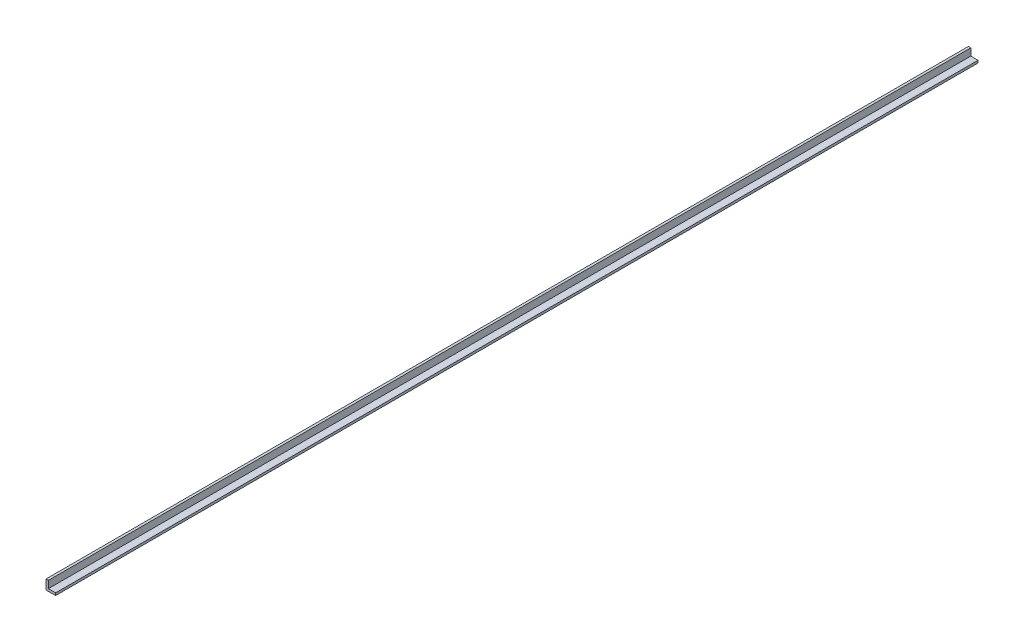
ISO-10303-21;
HEADER;
FILE_DESCRIPTION(('STEP AP214'),'2;1');
FILE_NAME('part.step','',(''),(''),'','','');
FILE_SCHEMA(('AUTOMOTIVE_DESIGN { 1 0 10303 214 1 1 1 1 }'));
ENDSEC;
DATA;
#1=APPLICATION_CONTEXT('core data for automotive mechanical design processes');
#2=APPLICATION_PROTOCOL_DEFINITION('international standard','automotive_design',2000,#1);
#3=PRODUCT_CONTEXT('',#1,'mechanical');
#4=PRODUCT('Part','Part','',(#3));
#5=PRODUCT_RELATED_PRODUCT_CATEGORY('part','',(#4));
#6=PRODUCT_DEFINITION_FORMATION('','',#4);
#7=PRODUCT_DEFINITION_CONTEXT('part definition',#1,'design');
#8=PRODUCT_DEFINITION('design','',#6,#7);
#9=PRODUCT_DEFINITION_SHAPE('','',#8);
#10=(LENGTH_UNIT() NAMED_UNIT(*) SI_UNIT(.MILLI.,.METRE.));
#11=(NAMED_UNIT(*) PLANE_ANGLE_UNIT() SI_UNIT($,.RADIAN.));
#12=(NAMED_UNIT(*) SI_UNIT($,.STERADIAN.) SOLID_ANGLE_UNIT());
#13=UNCERTAINTY_MEASURE_WITH_UNIT(LENGTH_MEASURE(1.E-05),#10,'distance_accuracy_value','');
#14=(GEOMETRIC_REPRESENTATION_CONTEXT(3) GLOBAL_UNCERTAINTY_ASSIGNED_CONTEXT((#13)) GLOBAL_UNIT_ASSIGNED_CONTEXT((#10,
#11,#12)) REPRESENTATION_CONTEXT('',''));
#15=CARTESIAN_POINT('',(0.,0.,0.));
#16=DIRECTION('',(0.,0.,1.));
#17=DIRECTION('',(1.,0.,0.));
#18=AXIS2_PLACEMENT_3D('',#15,#16,#17);
#19=CARTESIAN_POINT('',(12.7,0.,609.6));
#20=DIRECTION('',(0.,1.,0.));
#21=DIRECTION('',(0.,0.,1.));
#22=AXIS2_PLACEMENT_3D('',#19,#20,#21);
#23=PLANE('',#22);
#24=DIRECTION('',(1.,0.,0.));
#25=VECTOR('',#24,1.);
#26=CARTESIAN_POINT('',(12.7,0.,-609.6));
#27=LINE('',#26,#25);
#28=CARTESIAN_POINT('',(0.,0.,-609.6));
#29=VERTEX_POINT('',#28);
#30=CARTESIAN_POINT('',(12.7,0.,-609.6));
#31=VERTEX_POINT('',#30);
#32=EDGE_CURVE('E128',#29,#31,#27,.T.);
#33=ORIENTED_EDGE('',*,*,#32,.T.);
#34=DIRECTION('',(0.,0.,-1.));
#35=VECTOR('',#34,1.);
#36=CARTESIAN_POINT('',(12.7,0.,609.6));
#37=LINE('',#36,#35);
#38=CARTESIAN_POINT('',(12.7,0.,609.6));
#39=VERTEX_POINT('',#38);
#40=EDGE_CURVE('E11',#39,#31,#37,.T.);
#41=ORIENTED_EDGE('',*,*,#40,.F.);
#42=DIRECTION('',(1.,0.,0.));
#43=VECTOR('',#42,1.);
#44=CARTESIAN_POINT('',(12.7,0.,609.6));
#45=LINE('',#44,#43);
#46=CARTESIAN_POINT('',(0.,0.,609.6));
#47=VERTEX_POINT('',#46);
#48=EDGE_CURVE('E144',#47,#39,#45,.T.);
#49=ORIENTED_EDGE('',*,*,#48,.F.);
#50=DIRECTION('',(0.,0.,-1.));
#51=VECTOR('',#50,1.);
#52=CARTESIAN_POINT('',(0.,0.,609.6));
#53=LINE('',#52,#51);
#54=EDGE_CURVE('E124',#47,#29,#53,.T.);
#55=ORIENTED_EDGE('',*,*,#54,.T.);
#56=EDGE_LOOP('',(#33,#41,#49,#55));
#57=FACE_BOUND('',#56,.T.);
#58=ADVANCED_FACE('F39',(#57),#23,.F.);
#59=CARTESIAN_POINT('',(12.7,3.175,609.6));
#60=DIRECTION('',(-1.,0.,0.));
#61=DIRECTION('',(0.,-1.,0.));
#62=AXIS2_PLACEMENT_3D('',#59,#60,#61);
#63=PLANE('',#62);
#64=DIRECTION('',(0.,1.,0.));
#65=VECTOR('',#64,1.);
#66=CARTESIAN_POINT('',(12.7,3.175,-609.6));
#67=LINE('',#66,#65);
#68=CARTESIAN_POINT('',(12.7,3.175,-609.6));
#69=VERTEX_POINT('',#68);
#70=EDGE_CURVE('E132',#31,#69,#67,.T.);
#71=ORIENTED_EDGE('',*,*,#70,.T.);
#72=DIRECTION('',(0.,0.,-1.));
#73=VECTOR('',#72,1.);
#74=CARTESIAN_POINT('',(12.7,3.175,609.6));
#75=LINE('',#74,#73);
#76=CARTESIAN_POINT('',(12.7,3.175,609.6));
#77=VERTEX_POINT('',#76);
#78=EDGE_CURVE('E48',#77,#69,#75,.T.);
#79=ORIENTED_EDGE('',*,*,#78,.F.);
#80=DIRECTION('',(0.,1.,0.));
#81=VECTOR('',#80,1.);
#82=CARTESIAN_POINT('',(12.7,3.175,609.6));
#83=LINE('',#82,#81);
#84=EDGE_CURVE('E93',#39,#77,#83,.T.);
#85=ORIENTED_EDGE('',*,*,#84,.F.);
#86=ORIENTED_EDGE('',*,*,#40,.T.);
#87=EDGE_LOOP('',(#71,#79,#85,#86));
#88=FACE_BOUND('',#87,.T.);
#89=ADVANCED_FACE('F172',(#88),#63,.F.);
#90=CARTESIAN_POINT('',(3.175,3.175,609.6));
#91=DIRECTION('',(0.,-1.,0.));
#92=DIRECTION('',(0.,0.,-1.));
#93=AXIS2_PLACEMENT_3D('',#90,#91,#92);
#94=PLANE('',#93);
#95=DIRECTION('',(-1.,0.,0.));
#96=VECTOR('',#95,1.);
#97=CARTESIAN_POINT('',(3.175,3.175,-609.6));
#98=LINE('',#97,#96);
#99=CARTESIAN_POINT('',(3.175,3.175,-609.6));
#100=VERTEX_POINT('',#99);
#101=EDGE_CURVE('E135',#69,#100,#98,.T.);
#102=ORIENTED_EDGE('',*,*,#101,.T.);
#103=DIRECTION('',(0.,0.,-1.));
#104=VECTOR('',#103,1.);
#105=CARTESIAN_POINT('',(3.175,3.175,609.6));
#106=LINE('',#105,#104);
#107=CARTESIAN_POINT('',(3.175,3.175,609.6));
#108=VERTEX_POINT('',#107);
#109=EDGE_CURVE('E117',#108,#100,#106,.T.);
#110=ORIENTED_EDGE('',*,*,#109,.F.);
#111=DIRECTION('',(-1.,0.,0.));
#112=VECTOR('',#111,1.);
#113=CARTESIAN_POINT('',(3.175,3.175,609.6));
#114=LINE('',#113,#112);
#115=EDGE_CURVE('E106',#77,#108,#114,.T.);
#116=ORIENTED_EDGE('',*,*,#115,.F.);
#117=ORIENTED_EDGE('',*,*,#78,.T.);
#118=EDGE_LOOP('',(#102,#110,#116,#117));
#119=FACE_BOUND('',#118,.T.);
#120=ADVANCED_FACE('F154',(#119),#94,.F.);
#121=CARTESIAN_POINT('',(3.175,12.7,609.6));
#122=DIRECTION('',(-1.,0.,0.));
#123=DIRECTION('',(0.,-1.,0.));
#124=AXIS2_PLACEMENT_3D('',#121,#122,#123);
#125=PLANE('',#124);
#126=DIRECTION('',(0.,1.,0.));
#127=VECTOR('',#126,1.);
#128=CARTESIAN_POINT('',(3.175,12.7,-609.6));
#129=LINE('',#128,#127);
#130=CARTESIAN_POINT('',(3.175,12.7,-609.6));
#131=VERTEX_POINT('',#130);
#132=EDGE_CURVE('E115',#100,#131,#129,.T.);
#133=ORIENTED_EDGE('',*,*,#132,.T.);
#134=DIRECTION('',(0.,0.,-1.));
#135=VECTOR('',#134,1.);
#136=CARTESIAN_POINT('',(3.175,12.7,609.6));
#137=LINE('',#136,#135);
#138=CARTESIAN_POINT('',(3.175,12.7,609.6));
#139=VERTEX_POINT('',#138);
#140=EDGE_CURVE('E112',#139,#131,#137,.T.);
#141=ORIENTED_EDGE('',*,*,#140,.F.);
#142=DIRECTION('',(0.,1.,0.));
#143=VECTOR('',#142,1.);
#144=CARTESIAN_POINT('',(3.175,12.7,609.6));
#145=LINE('',#144,#143);
#146=EDGE_CURVE('E100',#108,#139,#145,.T.);
#147=ORIENTED_EDGE('',*,*,#146,.F.);
#148=ORIENTED_EDGE('',*,*,#109,.T.);
#149=EDGE_LOOP('',(#133,#141,#147,#148));
#150=FACE_BOUND('',#149,.T.);
#151=ADVANCED_FACE('F113',(#150),#125,.F.);
#152=CARTESIAN_POINT('',(0.,12.7,609.6));
#153=DIRECTION('',(0.,-1.,0.));
#154=DIRECTION('',(0.,0.,-1.));
#155=AXIS2_PLACEMENT_3D('',#152,#153,#154);
#156=PLANE('',#155);
#157=DIRECTION('',(-1.,0.,0.));
#158=VECTOR('',#157,1.);
#159=CARTESIAN_POINT('',(0.,12.7,-609.6));
#160=LINE('',#159,#158);
#161=CARTESIAN_POINT('',(0.,12.7,-609.6));
#162=VERTEX_POINT('',#161);
#163=EDGE_CURVE('E79',#131,#162,#160,.T.);
#164=ORIENTED_EDGE('',*,*,#163,.T.);
#165=DIRECTION('',(0.,0.,-1.));
#166=VECTOR('',#165,1.);
#167=CARTESIAN_POINT('',(0.,12.7,609.6));
#168=LINE('',#167,#166);
#169=CARTESIAN_POINT('',(0.,12.7,609.6));
#170=VERTEX_POINT('',#169);
#171=EDGE_CURVE('E118',#170,#162,#168,.T.);
#172=ORIENTED_EDGE('',*,*,#171,.F.);
#173=DIRECTION('',(-1.,0.,0.));
#174=VECTOR('',#173,1.);
#175=CARTESIAN_POINT('',(0.,12.7,609.6));
#176=LINE('',#175,#174);
#177=EDGE_CURVE('E104',#139,#170,#176,.T.);
#178=ORIENTED_EDGE('',*,*,#177,.F.);
#179=ORIENTED_EDGE('',*,*,#140,.T.);
#180=EDGE_LOOP('',(#164,#172,#178,#179));
#181=FACE_BOUND('',#180,.T.);
#182=ADVANCED_FACE('F120',(#181),#156,.F.);
#183=CARTESIAN_POINT('',(0.,0.,609.6));
#184=DIRECTION('',(1.,0.,0.));
#185=DIRECTION('',(0.,0.,-1.));
#186=AXIS2_PLACEMENT_3D('',#183,#184,#185);
#187=PLANE('',#186);
#188=DIRECTION('',(0.,-1.,0.));
#189=VECTOR('',#188,1.);
#190=CARTESIAN_POINT('',(0.,0.,-609.6));
#191=LINE('',#190,#189);
#192=EDGE_CURVE('E85',#162,#29,#191,.T.);
#193=ORIENTED_EDGE('',*,*,#192,.T.);
#194=ORIENTED_EDGE('',*,*,#54,.F.);
#195=DIRECTION('',(0.,-1.,0.));
#196=VECTOR('',#195,1.);
#197=CARTESIAN_POINT('',(0.,0.,609.6));
#198=LINE('',#197,#196);
#199=EDGE_CURVE('E56',#170,#47,#198,.T.);
#200=ORIENTED_EDGE('',*,*,#199,.F.);
#201=ORIENTED_EDGE('',*,*,#171,.T.);
#202=EDGE_LOOP('',(#193,#194,#200,#201));
#203=FACE_BOUND('',#202,.T.);
#204=ADVANCED_FACE('F161',(#203),#187,.F.);
#205=CARTESIAN_POINT('',(0.,0.,609.6));
#206=DIRECTION('',(0.,0.,-1.));
#207=DIRECTION('',(-1.,0.,0.));
#208=AXIS2_PLACEMENT_3D('',#205,#206,#207);
#209=PLANE('',#208);
#210=ORIENTED_EDGE('',*,*,#48,.T.);
#211=ORIENTED_EDGE('',*,*,#84,.T.);
#212=ORIENTED_EDGE('',*,*,#115,.T.);
#213=ORIENTED_EDGE('',*,*,#146,.T.);
#214=ORIENTED_EDGE('',*,*,#177,.T.);
#215=ORIENTED_EDGE('',*,*,#199,.T.);
#216=EDGE_LOOP('',(#210,#211,#212,#213,#214,#215));
#217=FACE_BOUND('',#216,.T.);
#218=ADVANCED_FACE('F102',(#217),#209,.F.);
#219=CARTESIAN_POINT('',(0.,0.,-609.6));
#220=DIRECTION('',(0.,0.,-1.));
#221=DIRECTION('',(-1.,0.,0.));
#222=AXIS2_PLACEMENT_3D('',#219,#220,#221);
#223=PLANE('',#222);
#224=ORIENTED_EDGE('',*,*,#32,.F.);
#225=ORIENTED_EDGE('',*,*,#192,.F.);
#226=ORIENTED_EDGE('',*,*,#163,.F.);
#227=ORIENTED_EDGE('',*,*,#132,.F.);
#228=ORIENTED_EDGE('',*,*,#101,.F.);
#229=ORIENTED_EDGE('',*,*,#70,.F.);
#230=EDGE_LOOP('',(#224,#225,#226,#227,#228,#229));
#231=FACE_BOUND('',#230,.T.);
#232=ADVANCED_FACE('F157',(#231),#223,.T.);
#233=CLOSED_SHELL('',(#58,#89,#120,#151,#182,#204,#218,#232));
#234=MANIFOLD_SOLID_BREP('B2',#233);
#235=ADVANCED_BREP_SHAPE_REPRESENTATION('',(#18,#234),#14);
#236=SHAPE_DEFINITION_REPRESENTATION(#9,#235);
ENDSEC;
END-ISO-10303-21;
